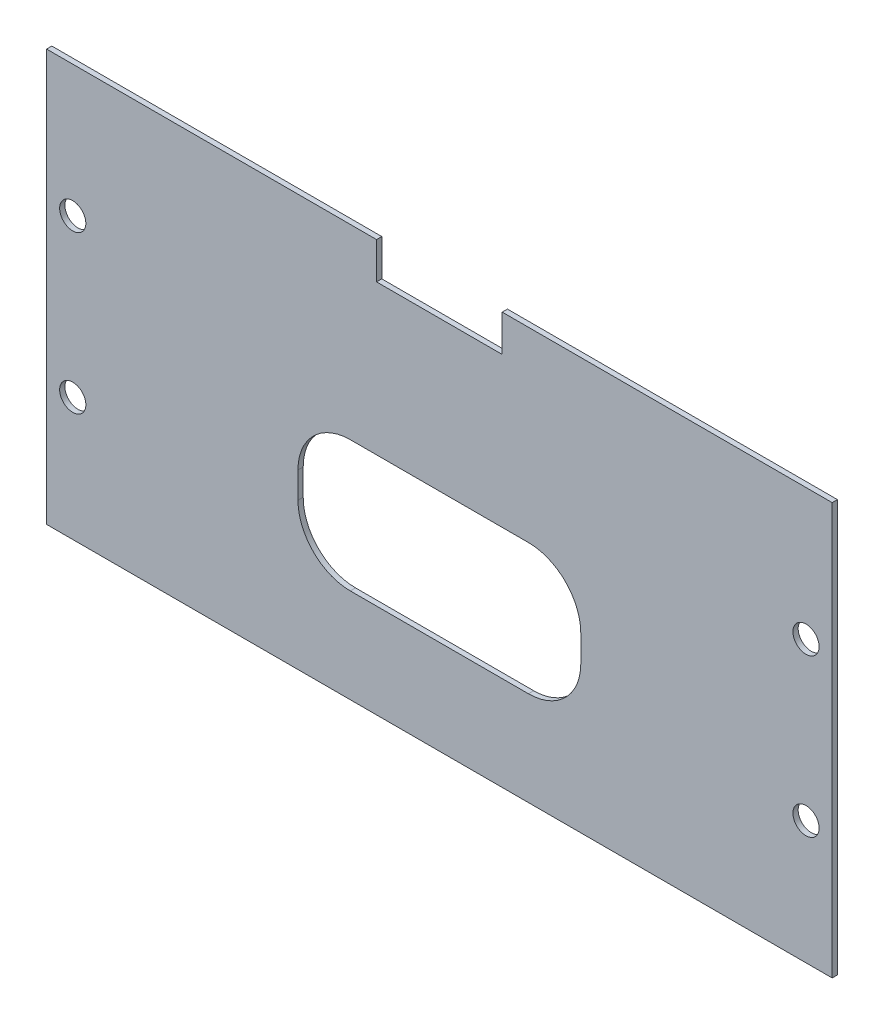
ISO-10303-21;
HEADER;
FILE_DESCRIPTION(('STEP AP214'),'2;1');
FILE_NAME('part.step','',(''),(''),'','','');
FILE_SCHEMA(('AUTOMOTIVE_DESIGN { 1 0 10303 214 1 1 1 1 }'));
ENDSEC;
DATA;
#1=APPLICATION_CONTEXT('core data for automotive mechanical design processes');
#2=APPLICATION_PROTOCOL_DEFINITION('international standard','automotive_design',2000,#1);
#3=PRODUCT_CONTEXT('',#1,'mechanical');
#4=PRODUCT('Part','Part','',(#3));
#5=PRODUCT_RELATED_PRODUCT_CATEGORY('part','',(#4));
#6=PRODUCT_DEFINITION_FORMATION('','',#4);
#7=PRODUCT_DEFINITION_CONTEXT('part definition',#1,'design');
#8=PRODUCT_DEFINITION('design','',#6,#7);
#9=PRODUCT_DEFINITION_SHAPE('','',#8);
#10=(LENGTH_UNIT() NAMED_UNIT(*) SI_UNIT(.MILLI.,.METRE.));
#11=(NAMED_UNIT(*) PLANE_ANGLE_UNIT() SI_UNIT($,.RADIAN.));
#12=(NAMED_UNIT(*) SI_UNIT($,.STERADIAN.) SOLID_ANGLE_UNIT());
#13=UNCERTAINTY_MEASURE_WITH_UNIT(LENGTH_MEASURE(1.E-05),#10,'distance_accuracy_value','');
#14=(GEOMETRIC_REPRESENTATION_CONTEXT(3) GLOBAL_UNCERTAINTY_ASSIGNED_CONTEXT((#13)) GLOBAL_UNIT_ASSIGNED_CONTEXT((#10,
#11,#12)) REPRESENTATION_CONTEXT('',''));
#15=CARTESIAN_POINT('',(0.,0.,0.));
#16=DIRECTION('',(0.,0.,1.));
#17=DIRECTION('',(1.,0.,0.));
#18=AXIS2_PLACEMENT_3D('',#15,#16,#17);
#19=CARTESIAN_POINT('',(-75.,41.8,1.));
#20=DIRECTION('',(0.,-1.,0.));
#21=DIRECTION('',(0.,0.,-1.));
#22=AXIS2_PLACEMENT_3D('',#19,#20,#21);
#23=PLANE('',#22);
#24=DIRECTION('',(-1.,0.,0.));
#25=VECTOR('',#24,1.);
#26=CARTESIAN_POINT('',(-75.,41.8,1.));
#27=LINE('',#26,#25);
#28=CARTESIAN_POINT('',(-12.,41.8,1.));
#29=VERTEX_POINT('',#28);
#30=CARTESIAN_POINT('',(-75.,41.8,1.));
#31=VERTEX_POINT('',#30);
#32=EDGE_CURVE('E172',#29,#31,#27,.T.);
#33=ORIENTED_EDGE('',*,*,#32,.F.);
#34=DIRECTION('',(0.,0.,-1.));
#35=VECTOR('',#34,1.);
#36=CARTESIAN_POINT('',(-12.,41.8,1.));
#37=LINE('',#36,#35);
#38=CARTESIAN_POINT('',(-12.,41.8,0.));
#39=VERTEX_POINT('',#38);
#40=EDGE_CURVE('E212',#29,#39,#37,.T.);
#41=ORIENTED_EDGE('',*,*,#40,.T.);
#42=DIRECTION('',(-1.,0.,0.));
#43=VECTOR('',#42,1.);
#44=CARTESIAN_POINT('',(-75.,41.8,0.));
#45=LINE('',#44,#43);
#46=CARTESIAN_POINT('',(-75.,41.8,0.));
#47=VERTEX_POINT('',#46);
#48=EDGE_CURVE('E188',#39,#47,#45,.T.);
#49=ORIENTED_EDGE('',*,*,#48,.T.);
#50=DIRECTION('',(0.,0.,-1.));
#51=VECTOR('',#50,1.);
#52=CARTESIAN_POINT('',(-75.,41.8,1.));
#53=LINE('',#52,#51);
#54=EDGE_CURVE('E185',#31,#47,#53,.T.);
#55=ORIENTED_EDGE('',*,*,#54,.F.);
#56=EDGE_LOOP('',(#33,#41,#49,#55));
#57=FACE_BOUND('',#56,.T.);
#58=ADVANCED_FACE('F37',(#57),#23,.F.);
#59=CARTESIAN_POINT('',(0.,0.,1.));
#60=DIRECTION('',(0.,0.,-1.));
#61=DIRECTION('',(-1.,0.,0.));
#62=AXIS2_PLACEMENT_3D('',#59,#60,#61);
#63=PLANE('',#62);
#64=CARTESIAN_POINT('',(-70.,-13.28,1.));
#65=DIRECTION('',(0.,0.,1.));
#66=DIRECTION('',(1.,0.,0.));
#67=AXIS2_PLACEMENT_3D('',#64,#65,#66);
#68=CIRCLE('',#67,2.50000000000001);
#69=CARTESIAN_POINT('',(-67.5,-13.28,1.));
#70=VERTEX_POINT('',#69);
#71=EDGE_CURVE('E354',#70,#70,#68,.T.);
#72=ORIENTED_EDGE('',*,*,#71,.F.);
#73=EDGE_LOOP('',(#72));
#74=FACE_BOUND('',#73,.T.);
#75=CARTESIAN_POINT('',(-70.,16.72,1.));
#76=DIRECTION('',(0.,0.,1.));
#77=DIRECTION('',(1.,0.,0.));
#78=AXIS2_PLACEMENT_3D('',#75,#76,#77);
#79=CIRCLE('',#78,2.5);
#80=CARTESIAN_POINT('',(-67.5,16.72,1.));
#81=VERTEX_POINT('',#80);
#82=EDGE_CURVE('E200',#81,#81,#79,.T.);
#83=ORIENTED_EDGE('',*,*,#82,.F.);
#84=EDGE_LOOP('',(#83));
#85=FACE_BOUND('',#84,.T.);
#86=DIRECTION('',(1.,0.,0.));
#87=VECTOR('',#86,1.);
#88=CARTESIAN_POINT('',(-27.,6.20000000000002,1.));
#89=LINE('',#88,#87);
#90=CARTESIAN_POINT('',(-17.,6.20000000000002,1.));
#91=VERTEX_POINT('',#90);
#92=CARTESIAN_POINT('',(17.,6.20000000000001,1.));
#93=VERTEX_POINT('',#92);
#94=EDGE_CURVE('E257',#91,#93,#89,.T.);
#95=ORIENTED_EDGE('',*,*,#94,.T.);
#96=CARTESIAN_POINT('',(17.,-3.79999999999999,1.));
#97=DIRECTION('',(0.,0.,-1.));
#98=DIRECTION('',(-1.,0.,0.));
#99=AXIS2_PLACEMENT_3D('',#96,#97,#98);
#100=CIRCLE('',#99,10.);
#101=CARTESIAN_POINT('',(27.,-3.79999999999998,1.));
#102=VERTEX_POINT('',#101);
#103=EDGE_CURVE('E240',#93,#102,#100,.T.);
#104=ORIENTED_EDGE('',*,*,#103,.T.);
#105=DIRECTION('',(0.,-1.,0.));
#106=VECTOR('',#105,1.);
#107=CARTESIAN_POINT('',(27.,6.20000000000001,1.));
#108=LINE('',#107,#106);
#109=CARTESIAN_POINT('',(27.,-8.79999999999999,1.));
#110=VERTEX_POINT('',#109);
#111=EDGE_CURVE('E280',#102,#110,#108,.T.);
#112=ORIENTED_EDGE('',*,*,#111,.T.);
#113=CARTESIAN_POINT('',(17.,-8.79999999999999,1.));
#114=DIRECTION('',(0.,0.,-1.));
#115=DIRECTION('',(-1.,0.,0.));
#116=AXIS2_PLACEMENT_3D('',#113,#114,#115);
#117=CIRCLE('',#116,10.);
#118=CARTESIAN_POINT('',(17.,-18.8,1.));
#119=VERTEX_POINT('',#118);
#120=EDGE_CURVE('E236',#110,#119,#117,.T.);
#121=ORIENTED_EDGE('',*,*,#120,.T.);
#122=DIRECTION('',(1.,0.,0.));
#123=VECTOR('',#122,1.);
#124=CARTESIAN_POINT('',(-27.,-18.8,1.));
#125=LINE('',#124,#123);
#126=CARTESIAN_POINT('',(-17.,-18.8,1.));
#127=VERTEX_POINT('',#126);
#128=EDGE_CURVE('E209',#127,#119,#125,.T.);
#129=ORIENTED_EDGE('',*,*,#128,.F.);
#130=CARTESIAN_POINT('',(-17.,-8.8,1.));
#131=DIRECTION('',(0.,0.,-1.));
#132=DIRECTION('',(-1.,0.,0.));
#133=AXIS2_PLACEMENT_3D('',#130,#131,#132);
#134=CIRCLE('',#133,10.);
#135=CARTESIAN_POINT('',(-27.,-8.79999999999998,1.));
#136=VERTEX_POINT('',#135);
#137=EDGE_CURVE('E45',#127,#136,#134,.T.);
#138=ORIENTED_EDGE('',*,*,#137,.T.);
#139=DIRECTION('',(0.,-1.,0.));
#140=VECTOR('',#139,1.);
#141=CARTESIAN_POINT('',(-27.,6.20000000000002,1.));
#142=LINE('',#141,#140);
#143=CARTESIAN_POINT('',(-27.,-3.79999999999997,1.));
#144=VERTEX_POINT('',#143);
#145=EDGE_CURVE('E181',#144,#136,#142,.T.);
#146=ORIENTED_EDGE('',*,*,#145,.F.);
#147=CARTESIAN_POINT('',(-17.,-3.79999999999998,1.));
#148=DIRECTION('',(0.,0.,-1.));
#149=DIRECTION('',(-1.,0.,0.));
#150=AXIS2_PLACEMENT_3D('',#147,#148,#149);
#151=CIRCLE('',#150,10.);
#152=EDGE_CURVE('E244',#144,#91,#151,.T.);
#153=ORIENTED_EDGE('',*,*,#152,.T.);
#154=EDGE_LOOP('',(#95,#104,#112,#121,#129,#138,#146,#153));
#155=FACE_BOUND('',#154,.T.);
#156=DIRECTION('',(0.,-1.,0.));
#157=VECTOR('',#156,1.);
#158=CARTESIAN_POINT('',(-75.,-41.8,1.));
#159=LINE('',#158,#157);
#160=CARTESIAN_POINT('',(-75.,-36.8,1.));
#161=VERTEX_POINT('',#160);
#162=EDGE_CURVE('E166',#31,#161,#159,.T.);
#163=ORIENTED_EDGE('',*,*,#162,.T.);
#164=DIRECTION('',(-1.,0.,0.));
#165=VECTOR('',#164,1.);
#166=CARTESIAN_POINT('',(-75.,-36.8,1.));
#167=LINE('',#166,#165);
#168=CARTESIAN_POINT('',(75.,-36.8,1.));
#169=VERTEX_POINT('',#168);
#170=EDGE_CURVE('E52',#169,#161,#167,.T.);
#171=ORIENTED_EDGE('',*,*,#170,.F.);
#172=DIRECTION('',(0.,1.,0.));
#173=VECTOR('',#172,1.);
#174=CARTESIAN_POINT('',(75.,-41.8,1.));
#175=LINE('',#174,#173);
#176=CARTESIAN_POINT('',(75.,41.8,1.));
#177=VERTEX_POINT('',#176);
#178=EDGE_CURVE('E163',#169,#177,#175,.T.);
#179=ORIENTED_EDGE('',*,*,#178,.T.);
#180=CARTESIAN_POINT('',(12.,41.8,1.));
#181=VERTEX_POINT('',#180);
#182=EDGE_CURVE('E175',#177,#181,#27,.T.);
#183=ORIENTED_EDGE('',*,*,#182,.T.);
#184=DIRECTION('',(0.,1.,0.));
#185=VECTOR('',#184,1.);
#186=CARTESIAN_POINT('',(12.,34.8,1.));
#187=LINE('',#186,#185);
#188=CARTESIAN_POINT('',(12.,34.8,1.));
#189=VERTEX_POINT('',#188);
#190=EDGE_CURVE('E532',#189,#181,#187,.T.);
#191=ORIENTED_EDGE('',*,*,#190,.F.);
#192=DIRECTION('',(1.,0.,0.));
#193=VECTOR('',#192,1.);
#194=CARTESIAN_POINT('',(0.,34.8,1.));
#195=LINE('',#194,#193);
#196=CARTESIAN_POINT('',(-12.,34.8,1.));
#197=VERTEX_POINT('',#196);
#198=EDGE_CURVE('E527',#197,#189,#195,.T.);
#199=ORIENTED_EDGE('',*,*,#198,.F.);
#200=DIRECTION('',(0.,-1.,0.));
#201=VECTOR('',#200,1.);
#202=CARTESIAN_POINT('',(-12.,41.8,1.));
#203=LINE('',#202,#201);
#204=EDGE_CURVE('E534',#29,#197,#203,.T.);
#205=ORIENTED_EDGE('',*,*,#204,.F.);
#206=ORIENTED_EDGE('',*,*,#32,.T.);
#207=EDGE_LOOP('',(#163,#171,#179,#183,#191,#199,#205,#206));
#208=FACE_BOUND('',#207,.T.);
#209=CARTESIAN_POINT('',(70.,-13.2800000000001,1.));
#210=DIRECTION('',(0.,0.,1.));
#211=DIRECTION('',(1.,0.,0.));
#212=AXIS2_PLACEMENT_3D('',#209,#210,#211);
#213=CIRCLE('',#212,2.50000000000001);
#214=CARTESIAN_POINT('',(72.5,-13.2800000000001,1.));
#215=VERTEX_POINT('',#214);
#216=EDGE_CURVE('E345',#215,#215,#213,.F.);
#217=ORIENTED_EDGE('',*,*,#216,.T.);
#218=EDGE_LOOP('',(#217));
#219=FACE_BOUND('',#218,.T.);
#220=CARTESIAN_POINT('',(70.0000000000001,16.7199999999999,1.));
#221=DIRECTION('',(0.,0.,1.));
#222=DIRECTION('',(1.,0.,0.));
#223=AXIS2_PLACEMENT_3D('',#220,#221,#222);
#224=CIRCLE('',#223,2.5);
#225=CARTESIAN_POINT('',(72.5000000000001,16.7199999999999,1.));
#226=VERTEX_POINT('',#225);
#227=EDGE_CURVE('E353',#226,#226,#224,.F.);
#228=ORIENTED_EDGE('',*,*,#227,.T.);
#229=EDGE_LOOP('',(#228));
#230=FACE_BOUND('',#229,.T.);
#231=ADVANCED_FACE('F160',(#74,#85,#155,#208,#219,#230),#63,.F.);
#232=CARTESIAN_POINT('',(0.,0.,0.));
#233=DIRECTION('',(0.,0.,-1.));
#234=DIRECTION('',(-1.,0.,0.));
#235=AXIS2_PLACEMENT_3D('',#232,#233,#234);
#236=PLANE('',#235);
#237=DIRECTION('',(1.,0.,0.));
#238=VECTOR('',#237,1.);
#239=CARTESIAN_POINT('',(0.,-36.8,0.));
#240=LINE('',#239,#238);
#241=CARTESIAN_POINT('',(-75.,-36.8,0.));
#242=VERTEX_POINT('',#241);
#243=CARTESIAN_POINT('',(75.,-36.8,0.));
#244=VERTEX_POINT('',#243);
#245=EDGE_CURVE('E152',#242,#244,#240,.T.);
#246=ORIENTED_EDGE('',*,*,#245,.F.);
#247=DIRECTION('',(0.,-1.,0.));
#248=VECTOR('',#247,1.);
#249=CARTESIAN_POINT('',(-75.,-41.8,0.));
#250=LINE('',#249,#248);
#251=EDGE_CURVE('E173',#47,#242,#250,.T.);
#252=ORIENTED_EDGE('',*,*,#251,.F.);
#253=ORIENTED_EDGE('',*,*,#48,.F.);
#254=DIRECTION('',(0.,1.,0.));
#255=VECTOR('',#254,1.);
#256=CARTESIAN_POINT('',(-12.,0.,0.));
#257=LINE('',#256,#255);
#258=CARTESIAN_POINT('',(-12.,34.8,0.));
#259=VERTEX_POINT('',#258);
#260=EDGE_CURVE('E342',#259,#39,#257,.T.);
#261=ORIENTED_EDGE('',*,*,#260,.F.);
#262=DIRECTION('',(-1.,0.,0.));
#263=VECTOR('',#262,1.);
#264=CARTESIAN_POINT('',(0.,34.8,0.));
#265=LINE('',#264,#263);
#266=CARTESIAN_POINT('',(12.,34.8,0.));
#267=VERTEX_POINT('',#266);
#268=EDGE_CURVE('E215',#267,#259,#265,.T.);
#269=ORIENTED_EDGE('',*,*,#268,.F.);
#270=DIRECTION('',(0.,-1.,0.));
#271=VECTOR('',#270,1.);
#272=CARTESIAN_POINT('',(12.,0.,0.));
#273=LINE('',#272,#271);
#274=CARTESIAN_POINT('',(12.,41.8,0.));
#275=VERTEX_POINT('',#274);
#276=EDGE_CURVE('E338',#275,#267,#273,.T.);
#277=ORIENTED_EDGE('',*,*,#276,.F.);
#278=CARTESIAN_POINT('',(75.,41.8,0.));
#279=VERTEX_POINT('',#278);
#280=EDGE_CURVE('E178',#279,#275,#45,.T.);
#281=ORIENTED_EDGE('',*,*,#280,.F.);
#282=DIRECTION('',(0.,1.,0.));
#283=VECTOR('',#282,1.);
#284=CARTESIAN_POINT('',(75.,-41.8,0.));
#285=LINE('',#284,#283);
#286=EDGE_CURVE('E186',#244,#279,#285,.T.);
#287=ORIENTED_EDGE('',*,*,#286,.F.);
#288=EDGE_LOOP('',(#246,#252,#253,#261,#269,#277,#281,#287));
#289=FACE_BOUND('',#288,.T.);
#290=CARTESIAN_POINT('',(-70.,-13.28,0.));
#291=DIRECTION('',(0.,0.,-1.));
#292=DIRECTION('',(-1.,0.,0.));
#293=AXIS2_PLACEMENT_3D('',#290,#291,#292);
#294=CIRCLE('',#293,2.50000000000001);
#295=CARTESIAN_POINT('',(-67.5,-13.28,0.));
#296=VERTEX_POINT('',#295);
#297=EDGE_CURVE('E206',#296,#296,#294,.T.);
#298=ORIENTED_EDGE('',*,*,#297,.F.);
#299=EDGE_LOOP('',(#298));
#300=FACE_BOUND('',#299,.T.);
#301=CARTESIAN_POINT('',(70.,-13.2800000000001,0.));
#302=DIRECTION('',(0.,0.,-1.));
#303=DIRECTION('',(-1.,0.,0.));
#304=AXIS2_PLACEMENT_3D('',#301,#302,#303);
#305=CIRCLE('',#304,2.50000000000001);
#306=CARTESIAN_POINT('',(72.5,-13.2800000000001,0.));
#307=VERTEX_POINT('',#306);
#308=EDGE_CURVE('E199',#307,#307,#305,.F.);
#309=ORIENTED_EDGE('',*,*,#308,.T.);
#310=EDGE_LOOP('',(#309));
#311=FACE_BOUND('',#310,.T.);
#312=CARTESIAN_POINT('',(-70.,16.72,0.));
#313=DIRECTION('',(0.,0.,-1.));
#314=DIRECTION('',(-1.,0.,0.));
#315=AXIS2_PLACEMENT_3D('',#312,#313,#314);
#316=CIRCLE('',#315,2.5);
#317=CARTESIAN_POINT('',(-67.5,16.72,0.));
#318=VERTEX_POINT('',#317);
#319=EDGE_CURVE('E196',#318,#318,#316,.T.);
#320=ORIENTED_EDGE('',*,*,#319,.F.);
#321=EDGE_LOOP('',(#320));
#322=FACE_BOUND('',#321,.T.);
#323=DIRECTION('',(0.,-1.,0.));
#324=VECTOR('',#323,1.);
#325=CARTESIAN_POINT('',(-27.,6.20000000000002,0.));
#326=LINE('',#325,#324);
#327=CARTESIAN_POINT('',(-27.,-3.79999999999997,0.));
#328=VERTEX_POINT('',#327);
#329=CARTESIAN_POINT('',(-27.,-8.79999999999998,0.));
#330=VERTEX_POINT('',#329);
#331=EDGE_CURVE('E189',#328,#330,#326,.T.);
#332=ORIENTED_EDGE('',*,*,#331,.T.);
#333=CARTESIAN_POINT('',(-17.,-8.8,0.));
#334=DIRECTION('',(0.,0.,-1.));
#335=DIRECTION('',(-1.,0.,0.));
#336=AXIS2_PLACEMENT_3D('',#333,#334,#335);
#337=CIRCLE('',#336,10.);
#338=CARTESIAN_POINT('',(-17.,-18.8,0.));
#339=VERTEX_POINT('',#338);
#340=EDGE_CURVE('E11',#330,#339,#337,.F.);
#341=ORIENTED_EDGE('',*,*,#340,.T.);
#342=DIRECTION('',(1.,0.,0.));
#343=VECTOR('',#342,1.);
#344=CARTESIAN_POINT('',(-27.,-18.8,0.));
#345=LINE('',#344,#343);
#346=CARTESIAN_POINT('',(17.,-18.8,0.));
#347=VERTEX_POINT('',#346);
#348=EDGE_CURVE('E256',#339,#347,#345,.T.);
#349=ORIENTED_EDGE('',*,*,#348,.T.);
#350=CARTESIAN_POINT('',(17.,-8.79999999999999,0.));
#351=DIRECTION('',(0.,0.,-1.));
#352=DIRECTION('',(-1.,0.,0.));
#353=AXIS2_PLACEMENT_3D('',#350,#351,#352);
#354=CIRCLE('',#353,10.);
#355=CARTESIAN_POINT('',(27.,-8.79999999999999,0.));
#356=VERTEX_POINT('',#355);
#357=EDGE_CURVE('E238',#347,#356,#354,.F.);
#358=ORIENTED_EDGE('',*,*,#357,.T.);
#359=DIRECTION('',(0.,-1.,0.));
#360=VECTOR('',#359,1.);
#361=CARTESIAN_POINT('',(27.,6.20000000000001,0.));
#362=LINE('',#361,#360);
#363=CARTESIAN_POINT('',(27.,-3.79999999999998,0.));
#364=VERTEX_POINT('',#363);
#365=EDGE_CURVE('E268',#364,#356,#362,.T.);
#366=ORIENTED_EDGE('',*,*,#365,.F.);
#367=CARTESIAN_POINT('',(17.,-3.79999999999999,0.));
#368=DIRECTION('',(0.,0.,-1.));
#369=DIRECTION('',(-1.,0.,0.));
#370=AXIS2_PLACEMENT_3D('',#367,#368,#369);
#371=CIRCLE('',#370,10.);
#372=CARTESIAN_POINT('',(17.,6.20000000000001,0.));
#373=VERTEX_POINT('',#372);
#374=EDGE_CURVE('E242',#364,#373,#371,.F.);
#375=ORIENTED_EDGE('',*,*,#374,.T.);
#376=DIRECTION('',(1.,0.,0.));
#377=VECTOR('',#376,1.);
#378=CARTESIAN_POINT('',(-27.,6.20000000000002,0.));
#379=LINE('',#378,#377);
#380=CARTESIAN_POINT('',(-17.,6.20000000000002,0.));
#381=VERTEX_POINT('',#380);
#382=EDGE_CURVE('E271',#381,#373,#379,.T.);
#383=ORIENTED_EDGE('',*,*,#382,.F.);
#384=CARTESIAN_POINT('',(-17.,-3.79999999999998,0.));
#385=DIRECTION('',(0.,0.,-1.));
#386=DIRECTION('',(-1.,0.,0.));
#387=AXIS2_PLACEMENT_3D('',#384,#385,#386);
#388=CIRCLE('',#387,10.);
#389=EDGE_CURVE('E246',#381,#328,#388,.F.);
#390=ORIENTED_EDGE('',*,*,#389,.T.);
#391=EDGE_LOOP('',(#332,#341,#349,#358,#366,#375,#383,#390));
#392=FACE_BOUND('',#391,.T.);
#393=CARTESIAN_POINT('',(70.0000000000001,16.7199999999999,0.));
#394=DIRECTION('',(0.,0.,-1.));
#395=DIRECTION('',(-1.,0.,0.));
#396=AXIS2_PLACEMENT_3D('',#393,#394,#395);
#397=CIRCLE('',#396,2.5);
#398=CARTESIAN_POINT('',(72.5000000000001,16.7199999999999,0.));
#399=VERTEX_POINT('',#398);
#400=EDGE_CURVE('E203',#399,#399,#397,.F.);
#401=ORIENTED_EDGE('',*,*,#400,.T.);
#402=EDGE_LOOP('',(#401));
#403=FACE_BOUND('',#402,.T.);
#404=ADVANCED_FACE('F262',(#289,#300,#311,#322,#392,#403),#236,.T.);
#405=CARTESIAN_POINT('',(75.,-41.8,1.));
#406=DIRECTION('',(-1.,0.,0.));
#407=DIRECTION('',(0.,0.,1.));
#408=AXIS2_PLACEMENT_3D('',#405,#406,#407);
#409=PLANE('',#408);
#410=ORIENTED_EDGE('',*,*,#178,.F.);
#411=DIRECTION('',(0.,0.,1.));
#412=VECTOR('',#411,1.);
#413=CARTESIAN_POINT('',(75.,-36.8,-9.));
#414=LINE('',#413,#412);
#415=EDGE_CURVE('E149',#244,#169,#414,.T.);
#416=ORIENTED_EDGE('',*,*,#415,.F.);
#417=ORIENTED_EDGE('',*,*,#286,.T.);
#418=DIRECTION('',(0.,0.,-1.));
#419=VECTOR('',#418,1.);
#420=CARTESIAN_POINT('',(75.,41.8,1.));
#421=LINE('',#420,#419);
#422=EDGE_CURVE('E171',#177,#279,#421,.T.);
#423=ORIENTED_EDGE('',*,*,#422,.F.);
#424=EDGE_LOOP('',(#410,#416,#417,#423));
#425=FACE_BOUND('',#424,.T.);
#426=ADVANCED_FACE('F169',(#425),#409,.F.);
#427=ORIENTED_EDGE('',*,*,#280,.T.);
#428=DIRECTION('',(0.,0.,1.));
#429=VECTOR('',#428,1.);
#430=CARTESIAN_POINT('',(12.,41.8,1.));
#431=LINE('',#430,#429);
#432=EDGE_CURVE('E195',#275,#181,#431,.T.);
#433=ORIENTED_EDGE('',*,*,#432,.T.);
#434=ORIENTED_EDGE('',*,*,#182,.F.);
#435=ORIENTED_EDGE('',*,*,#422,.T.);
#436=EDGE_LOOP('',(#427,#433,#434,#435));
#437=FACE_BOUND('',#436,.T.);
#438=ADVANCED_FACE('F317',(#437),#23,.F.);
#439=CARTESIAN_POINT('',(-75.,-41.8,1.));
#440=DIRECTION('',(1.,0.,0.));
#441=DIRECTION('',(0.,0.,-1.));
#442=AXIS2_PLACEMENT_3D('',#439,#440,#441);
#443=PLANE('',#442);
#444=ORIENTED_EDGE('',*,*,#251,.T.);
#445=DIRECTION('',(0.,0.,1.));
#446=VECTOR('',#445,1.);
#447=CARTESIAN_POINT('',(-75.,-36.8,-9.));
#448=LINE('',#447,#446);
#449=EDGE_CURVE('E156',#242,#161,#448,.T.);
#450=ORIENTED_EDGE('',*,*,#449,.T.);
#451=ORIENTED_EDGE('',*,*,#162,.F.);
#452=ORIENTED_EDGE('',*,*,#54,.T.);
#453=EDGE_LOOP('',(#444,#450,#451,#452));
#454=FACE_BOUND('',#453,.T.);
#455=ADVANCED_FACE('F326',(#454),#443,.F.);
#456=CARTESIAN_POINT('',(-27.,-18.8,0.));
#457=DIRECTION('',(0.,-1.,0.));
#458=DIRECTION('',(1.,0.,0.));
#459=AXIS2_PLACEMENT_3D('',#456,#457,#458);
#460=PLANE('',#459);
#461=ORIENTED_EDGE('',*,*,#128,.T.);
#462=DIRECTION('',(0.,0.,1.));
#463=VECTOR('',#462,1.);
#464=CARTESIAN_POINT('',(17.,-18.8,0.));
#465=LINE('',#464,#463);
#466=EDGE_CURVE('E225',#119,#347,#465,.F.);
#467=ORIENTED_EDGE('',*,*,#466,.T.);
#468=ORIENTED_EDGE('',*,*,#348,.F.);
#469=DIRECTION('',(0.,0.,1.));
#470=VECTOR('',#469,1.);
#471=CARTESIAN_POINT('',(-17.,-18.8,1.));
#472=LINE('',#471,#470);
#473=EDGE_CURVE('E222',#339,#127,#472,.T.);
#474=ORIENTED_EDGE('',*,*,#473,.T.);
#475=EDGE_LOOP('',(#461,#467,#468,#474));
#476=FACE_BOUND('',#475,.T.);
#477=ADVANCED_FACE('F266',(#476),#460,.F.);
#478=CARTESIAN_POINT('',(-27.,6.20000000000002,0.));
#479=DIRECTION('',(-1.,0.,0.));
#480=DIRECTION('',(0.,-1.,0.));
#481=AXIS2_PLACEMENT_3D('',#478,#479,#480);
#482=PLANE('',#481);
#483=ORIENTED_EDGE('',*,*,#331,.F.);
#484=DIRECTION('',(0.,0.,1.));
#485=VECTOR('',#484,1.);
#486=CARTESIAN_POINT('',(-27.,-3.79999999999997,0.));
#487=LINE('',#486,#485);
#488=EDGE_CURVE('E233',#328,#144,#487,.T.);
#489=ORIENTED_EDGE('',*,*,#488,.T.);
#490=ORIENTED_EDGE('',*,*,#145,.T.);
#491=DIRECTION('',(0.,0.,1.));
#492=VECTOR('',#491,1.);
#493=CARTESIAN_POINT('',(-27.,-8.79999999999998,0.));
#494=LINE('',#493,#492);
#495=EDGE_CURVE('E60',#136,#330,#494,.F.);
#496=ORIENTED_EDGE('',*,*,#495,.T.);
#497=EDGE_LOOP('',(#483,#489,#490,#496));
#498=FACE_BOUND('',#497,.T.);
#499=ADVANCED_FACE('F254',(#498),#482,.F.);
#500=CARTESIAN_POINT('',(-27.,6.20000000000002,0.));
#501=DIRECTION('',(0.,-1.,0.));
#502=DIRECTION('',(1.,0.,0.));
#503=AXIS2_PLACEMENT_3D('',#500,#501,#502);
#504=PLANE('',#503);
#505=ORIENTED_EDGE('',*,*,#382,.T.);
#506=DIRECTION('',(0.,0.,1.));
#507=VECTOR('',#506,1.);
#508=CARTESIAN_POINT('',(17.,6.20000000000002,1.));
#509=LINE('',#508,#507);
#510=EDGE_CURVE('E229',#373,#93,#509,.T.);
#511=ORIENTED_EDGE('',*,*,#510,.T.);
#512=ORIENTED_EDGE('',*,*,#94,.F.);
#513=DIRECTION('',(0.,0.,1.));
#514=VECTOR('',#513,1.);
#515=CARTESIAN_POINT('',(-17.,6.20000000000002,0.));
#516=LINE('',#515,#514);
#517=EDGE_CURVE('E227',#91,#381,#516,.F.);
#518=ORIENTED_EDGE('',*,*,#517,.T.);
#519=EDGE_LOOP('',(#505,#511,#512,#518));
#520=FACE_BOUND('',#519,.T.);
#521=ADVANCED_FACE('F286',(#520),#504,.T.);
#522=CARTESIAN_POINT('',(27.,6.20000000000001,0.));
#523=DIRECTION('',(-1.,0.,0.));
#524=DIRECTION('',(0.,-1.,0.));
#525=AXIS2_PLACEMENT_3D('',#522,#523,#524);
#526=PLANE('',#525);
#527=ORIENTED_EDGE('',*,*,#365,.T.);
#528=DIRECTION('',(0.,0.,1.));
#529=VECTOR('',#528,1.);
#530=CARTESIAN_POINT('',(27.,-8.79999999999999,0.));
#531=LINE('',#530,#529);
#532=EDGE_CURVE('E219',#356,#110,#531,.T.);
#533=ORIENTED_EDGE('',*,*,#532,.T.);
#534=ORIENTED_EDGE('',*,*,#111,.F.);
#535=DIRECTION('',(0.,0.,1.));
#536=VECTOR('',#535,1.);
#537=CARTESIAN_POINT('',(27.,-3.79999999999998,0.));
#538=LINE('',#537,#536);
#539=EDGE_CURVE('E217',#102,#364,#538,.F.);
#540=ORIENTED_EDGE('',*,*,#539,.T.);
#541=EDGE_LOOP('',(#527,#533,#534,#540));
#542=FACE_BOUND('',#541,.T.);
#543=ADVANCED_FACE('F298',(#542),#526,.T.);
#544=CARTESIAN_POINT('',(-70.,16.72,-5.5));
#545=DIRECTION('',(0.,0.,1.));
#546=DIRECTION('',(1.,0.,0.));
#547=AXIS2_PLACEMENT_3D('',#544,#545,#546);
#548=CYLINDRICAL_SURFACE('',#547,2.5);
#549=CARTESIAN_POINT('',(-67.5,16.72,0.));
#550=CARTESIAN_POINT('',(-67.5,16.72,0.0104166666666675));
#551=CARTESIAN_POINT('',(-67.5,16.72,0.0208333333333342));
#552=CARTESIAN_POINT('',(-67.5,16.72,0.0416666666666676));
#553=CARTESIAN_POINT('',(-67.5,16.72,0.0520833333333343));
#554=CARTESIAN_POINT('',(-67.5,16.72,0.0729166666666676));
#555=CARTESIAN_POINT('',(-67.5,16.72,0.0833333333333343));
#556=CARTESIAN_POINT('',(-67.5,16.72,0.104166666666668));
#557=CARTESIAN_POINT('',(-67.5,16.72,0.114583333333334));
#558=CARTESIAN_POINT('',(-67.5,16.72,0.135416666666668));
#559=CARTESIAN_POINT('',(-67.5,16.72,0.145833333333334));
#560=CARTESIAN_POINT('',(-67.5,16.72,0.166666666666668));
#561=CARTESIAN_POINT('',(-67.5,16.72,0.177083333333334));
#562=CARTESIAN_POINT('',(-67.5,16.72,0.197916666666668));
#563=CARTESIAN_POINT('',(-67.5,16.72,0.208333333333334));
#564=CARTESIAN_POINT('',(-67.5,16.72,0.229166666666668));
#565=CARTESIAN_POINT('',(-67.5,16.72,0.239583333333334));
#566=CARTESIAN_POINT('',(-67.5,16.72,0.260416666666667));
#567=CARTESIAN_POINT('',(-67.5,16.72,0.270833333333334));
#568=CARTESIAN_POINT('',(-67.5,16.72,0.291666666666667));
#569=CARTESIAN_POINT('',(-67.5,16.72,0.302083333333334));
#570=CARTESIAN_POINT('',(-67.5,16.72,0.322916666666667));
#571=CARTESIAN_POINT('',(-67.5,16.72,0.333333333333334));
#572=CARTESIAN_POINT('',(-67.5,16.72,0.354166666666667));
#573=CARTESIAN_POINT('',(-67.5,16.72,0.364583333333334));
#574=CARTESIAN_POINT('',(-67.5,16.72,0.385416666666667));
#575=CARTESIAN_POINT('',(-67.5,16.72,0.395833333333334));
#576=CARTESIAN_POINT('',(-67.5,16.72,0.416666666666667));
#577=CARTESIAN_POINT('',(-67.5,16.72,0.427083333333334));
#578=CARTESIAN_POINT('',(-67.5,16.72,0.447916666666667));
#579=CARTESIAN_POINT('',(-67.5,16.72,0.458333333333334));
#580=CARTESIAN_POINT('',(-67.5,16.72,0.479166666666667));
#581=CARTESIAN_POINT('',(-67.5,16.72,0.489583333333334));
#582=CARTESIAN_POINT('',(-67.5,16.72,0.510416666666667));
#583=CARTESIAN_POINT('',(-67.5,16.72,0.520833333333334));
#584=CARTESIAN_POINT('',(-67.5,16.72,0.541666666666667));
#585=CARTESIAN_POINT('',(-67.5,16.72,0.552083333333334));
#586=CARTESIAN_POINT('',(-67.5,16.72,0.572916666666667));
#587=CARTESIAN_POINT('',(-67.5,16.72,0.583333333333334));
#588=CARTESIAN_POINT('',(-67.5,16.72,0.604166666666667));
#589=CARTESIAN_POINT('',(-67.5,16.72,0.614583333333334));
#590=CARTESIAN_POINT('',(-67.5,16.72,0.635416666666667));
#591=CARTESIAN_POINT('',(-67.5,16.72,0.645833333333334));
#592=CARTESIAN_POINT('',(-67.5,16.72,0.666666666666667));
#593=CARTESIAN_POINT('',(-67.5,16.72,0.677083333333334));
#594=CARTESIAN_POINT('',(-67.5,16.72,0.697916666666667));
#595=CARTESIAN_POINT('',(-67.5,16.72,0.708333333333333));
#596=CARTESIAN_POINT('',(-67.5,16.72,0.729166666666667));
#597=CARTESIAN_POINT('',(-67.5,16.72,0.739583333333333));
#598=CARTESIAN_POINT('',(-67.5,16.72,0.760416666666667));
#599=CARTESIAN_POINT('',(-67.5,16.72,0.770833333333333));
#600=CARTESIAN_POINT('',(-67.5,16.72,0.791666666666667));
#601=CARTESIAN_POINT('',(-67.5,16.72,0.802083333333333));
#602=CARTESIAN_POINT('',(-67.5,16.72,0.822916666666667));
#603=CARTESIAN_POINT('',(-67.5,16.72,0.833333333333333));
#604=CARTESIAN_POINT('',(-67.5,16.72,0.854166666666667));
#605=CARTESIAN_POINT('',(-67.5,16.72,0.864583333333333));
#606=CARTESIAN_POINT('',(-67.5,16.72,0.885416666666667));
#607=CARTESIAN_POINT('',(-67.5,16.72,0.895833333333333));
#608=CARTESIAN_POINT('',(-67.5,16.72,0.916666666666667));
#609=CARTESIAN_POINT('',(-67.5,16.72,0.927083333333333));
#610=CARTESIAN_POINT('',(-67.5,16.72,0.947916666666667));
#611=CARTESIAN_POINT('',(-67.5,16.72,0.958333333333333));
#612=CARTESIAN_POINT('',(-67.5,16.72,0.979166666666667));
#613=CARTESIAN_POINT('',(-67.5,16.72,0.989583333333333));
#614=CARTESIAN_POINT('',(-67.5,16.72,1.));
#615=B_SPLINE_CURVE_WITH_KNOTS('',3,(#549,#550,#551,#552,#553,#554,#555,#556,#557,#558,#559,
#560,#561,#562,#563,#564,#565,#566,#567,#568,#569,#570,#571,#572,#573,#574,#575,#576,#577,#578,
#579,#580,#581,#582,#583,#584,#585,#586,#587,#588,#589,#590,#591,#592,#593,#594,#595,#596,#597,
#598,#599,#600,#601,#602,#603,#604,#605,#606,#607,#608,#609,#610,#611,#612,#613,#614),
.UNSPECIFIED.,.F.,.F.,(4,2,2,2,2,2,2,2,2,2,2,2,2,2,2,2,2,2,2,2,2,2,2,2,2,2,2,2,2,2,2,2,4),(0.,
0.03125,0.0625000000000001,0.0937500000000001,0.125,0.15625,0.1875,0.21875,0.25,
0.281249999999999,0.312499999999999,0.343749999999999,0.374999999999999,0.40625,0.4375,0.46875,
0.5,0.53125,0.5625,0.59375,0.625,0.65625,0.6875,0.718749999999999,0.749999999999999,
0.781249999999999,0.812499999999999,0.843749999999999,0.874999999999999,0.906249999999999,
0.937499999999999,0.968749999999999,0.999999999999999),.UNSPECIFIED.);
#616=EDGE_CURVE('BSEAM373',#318,#81,#615,.T.);
#617=ORIENTED_EDGE('',*,*,#319,.T.);
#618=ORIENTED_EDGE('',*,*,#82,.T.);
#619=ORIENTED_EDGE('',*,*,#616,.T.);
#620=ORIENTED_EDGE('',*,*,#616,.F.);
#621=EDGE_LOOP('',(#617,#619,#618,#620));
#622=FACE_BOUND('',#621,.T.);
#623=ADVANCED_FACE('F373',(#622),#548,.F.);
#624=CARTESIAN_POINT('',(70.,-13.2800000000001,-5.5));
#625=DIRECTION('',(0.,0.,1.));
#626=DIRECTION('',(1.,0.,0.));
#627=AXIS2_PLACEMENT_3D('',#624,#625,#626);
#628=CYLINDRICAL_SURFACE('',#627,2.50000000000001);
#629=CARTESIAN_POINT('',(72.5,-13.2800000000001,0.));
#630=CARTESIAN_POINT('',(72.5,-13.2800000000001,0.0104166666666675));
#631=CARTESIAN_POINT('',(72.5,-13.2800000000001,0.0208333333333342));
#632=CARTESIAN_POINT('',(72.5,-13.2800000000001,0.0416666666666676));
#633=CARTESIAN_POINT('',(72.5,-13.2800000000001,0.0520833333333343));
#634=CARTESIAN_POINT('',(72.5,-13.2800000000001,0.0729166666666676));
#635=CARTESIAN_POINT('',(72.5,-13.2800000000001,0.0833333333333343));
#636=CARTESIAN_POINT('',(72.5,-13.2800000000001,0.104166666666668));
#637=CARTESIAN_POINT('',(72.5,-13.2800000000001,0.114583333333334));
#638=CARTESIAN_POINT('',(72.5,-13.2800000000001,0.135416666666668));
#639=CARTESIAN_POINT('',(72.5,-13.2800000000001,0.145833333333334));
#640=CARTESIAN_POINT('',(72.5,-13.2800000000001,0.166666666666668));
#641=CARTESIAN_POINT('',(72.5,-13.2800000000001,0.177083333333334));
#642=CARTESIAN_POINT('',(72.5,-13.2800000000001,0.197916666666668));
#643=CARTESIAN_POINT('',(72.5,-13.2800000000001,0.208333333333334));
#644=CARTESIAN_POINT('',(72.5,-13.2800000000001,0.229166666666668));
#645=CARTESIAN_POINT('',(72.5,-13.2800000000001,0.239583333333334));
#646=CARTESIAN_POINT('',(72.5,-13.2800000000001,0.260416666666667));
#647=CARTESIAN_POINT('',(72.5,-13.2800000000001,0.270833333333334));
#648=CARTESIAN_POINT('',(72.5,-13.2800000000001,0.291666666666667));
#649=CARTESIAN_POINT('',(72.5,-13.2800000000001,0.302083333333334));
#650=CARTESIAN_POINT('',(72.5,-13.2800000000001,0.322916666666667));
#651=CARTESIAN_POINT('',(72.5,-13.2800000000001,0.333333333333334));
#652=CARTESIAN_POINT('',(72.5,-13.2800000000001,0.354166666666667));
#653=CARTESIAN_POINT('',(72.5,-13.2800000000001,0.364583333333334));
#654=CARTESIAN_POINT('',(72.5,-13.2800000000001,0.385416666666667));
#655=CARTESIAN_POINT('',(72.5,-13.2800000000001,0.395833333333334));
#656=CARTESIAN_POINT('',(72.5,-13.2800000000001,0.416666666666667));
#657=CARTESIAN_POINT('',(72.5,-13.2800000000001,0.427083333333334));
#658=CARTESIAN_POINT('',(72.5,-13.2800000000001,0.447916666666667));
#659=CARTESIAN_POINT('',(72.5,-13.2800000000001,0.458333333333334));
#660=CARTESIAN_POINT('',(72.5,-13.2800000000001,0.479166666666667));
#661=CARTESIAN_POINT('',(72.5,-13.2800000000001,0.489583333333334));
#662=CARTESIAN_POINT('',(72.5,-13.2800000000001,0.510416666666667));
#663=CARTESIAN_POINT('',(72.5,-13.2800000000001,0.520833333333334));
#664=CARTESIAN_POINT('',(72.5,-13.2800000000001,0.541666666666667));
#665=CARTESIAN_POINT('',(72.5,-13.2800000000001,0.552083333333334));
#666=CARTESIAN_POINT('',(72.5,-13.2800000000001,0.572916666666667));
#667=CARTESIAN_POINT('',(72.5,-13.2800000000001,0.583333333333334));
#668=CARTESIAN_POINT('',(72.5,-13.2800000000001,0.604166666666667));
#669=CARTESIAN_POINT('',(72.5,-13.2800000000001,0.614583333333334));
#670=CARTESIAN_POINT('',(72.5,-13.2800000000001,0.635416666666667));
#671=CARTESIAN_POINT('',(72.5,-13.2800000000001,0.645833333333334));
#672=CARTESIAN_POINT('',(72.5,-13.2800000000001,0.666666666666667));
#673=CARTESIAN_POINT('',(72.5,-13.2800000000001,0.677083333333334));
#674=CARTESIAN_POINT('',(72.5,-13.2800000000001,0.697916666666667));
#675=CARTESIAN_POINT('',(72.5,-13.2800000000001,0.708333333333333));
#676=CARTESIAN_POINT('',(72.5,-13.2800000000001,0.729166666666667));
#677=CARTESIAN_POINT('',(72.5,-13.2800000000001,0.739583333333333));
#678=CARTESIAN_POINT('',(72.5,-13.2800000000001,0.760416666666667));
#679=CARTESIAN_POINT('',(72.5,-13.2800000000001,0.770833333333333));
#680=CARTESIAN_POINT('',(72.5,-13.2800000000001,0.791666666666667));
#681=CARTESIAN_POINT('',(72.5,-13.2800000000001,0.802083333333333));
#682=CARTESIAN_POINT('',(72.5,-13.2800000000001,0.822916666666667));
#683=CARTESIAN_POINT('',(72.5,-13.2800000000001,0.833333333333333));
#684=CARTESIAN_POINT('',(72.5,-13.2800000000001,0.854166666666667));
#685=CARTESIAN_POINT('',(72.5,-13.2800000000001,0.864583333333333));
#686=CARTESIAN_POINT('',(72.5,-13.2800000000001,0.885416666666667));
#687=CARTESIAN_POINT('',(72.5,-13.2800000000001,0.895833333333333));
#688=CARTESIAN_POINT('',(72.5,-13.2800000000001,0.916666666666667));
#689=CARTESIAN_POINT('',(72.5,-13.2800000000001,0.927083333333333));
#690=CARTESIAN_POINT('',(72.5,-13.2800000000001,0.947916666666667));
#691=CARTESIAN_POINT('',(72.5,-13.2800000000001,0.958333333333333));
#692=CARTESIAN_POINT('',(72.5,-13.2800000000001,0.979166666666667));
#693=CARTESIAN_POINT('',(72.5,-13.2800000000001,0.989583333333333));
#694=CARTESIAN_POINT('',(72.5,-13.2800000000001,1.));
#695=B_SPLINE_CURVE_WITH_KNOTS('',3,(#629,#630,#631,#632,#633,#634,#635,#636,#637,#638,#639,
#640,#641,#642,#643,#644,#645,#646,#647,#648,#649,#650,#651,#652,#653,#654,#655,#656,#657,#658,
#659,#660,#661,#662,#663,#664,#665,#666,#667,#668,#669,#670,#671,#672,#673,#674,#675,#676,#677,
#678,#679,#680,#681,#682,#683,#684,#685,#686,#687,#688,#689,#690,#691,#692,#693,#694),
.UNSPECIFIED.,.F.,.F.,(4,2,2,2,2,2,2,2,2,2,2,2,2,2,2,2,2,2,2,2,2,2,2,2,2,2,2,2,2,2,2,2,4),(0.,
0.03125,0.0625000000000001,0.0937500000000001,0.125,0.15625,0.1875,0.21875,0.25,
0.281249999999999,0.312499999999999,0.343749999999999,0.374999999999999,0.40625,0.4375,0.46875,
0.5,0.53125,0.5625,0.59375,0.625,0.65625,0.6875,0.718749999999999,0.749999999999999,
0.781249999999999,0.812499999999999,0.843749999999999,0.874999999999999,0.906249999999999,
0.937499999999999,0.968749999999999,0.999999999999999),.UNSPECIFIED.);
#696=EDGE_CURVE('BSEAM363',#307,#215,#695,.T.);
#697=ORIENTED_EDGE('',*,*,#308,.F.);
#698=ORIENTED_EDGE('',*,*,#216,.F.);
#699=ORIENTED_EDGE('',*,*,#696,.T.);
#700=ORIENTED_EDGE('',*,*,#696,.F.);
#701=EDGE_LOOP('',(#697,#699,#698,#700));
#702=FACE_BOUND('',#701,.T.);
#703=ADVANCED_FACE('F363',(#702),#628,.F.);
#704=CARTESIAN_POINT('',(70.0000000000001,16.7199999999999,-5.5));
#705=DIRECTION('',(0.,0.,1.));
#706=DIRECTION('',(1.,0.,0.));
#707=AXIS2_PLACEMENT_3D('',#704,#705,#706);
#708=CYLINDRICAL_SURFACE('',#707,2.5);
#709=CARTESIAN_POINT('',(72.5000000000001,16.7199999999999,0.));
#710=CARTESIAN_POINT('',(72.5000000000001,16.7199999999999,0.0104166666666675));
#711=CARTESIAN_POINT('',(72.5000000000001,16.7199999999999,0.0208333333333342));
#712=CARTESIAN_POINT('',(72.5000000000001,16.7199999999999,0.0416666666666676));
#713=CARTESIAN_POINT('',(72.5000000000001,16.7199999999999,0.0520833333333343));
#714=CARTESIAN_POINT('',(72.5000000000001,16.7199999999999,0.0729166666666676));
#715=CARTESIAN_POINT('',(72.5000000000001,16.7199999999999,0.0833333333333343));
#716=CARTESIAN_POINT('',(72.5000000000001,16.7199999999999,0.104166666666668));
#717=CARTESIAN_POINT('',(72.5000000000001,16.7199999999999,0.114583333333334));
#718=CARTESIAN_POINT('',(72.5000000000001,16.7199999999999,0.135416666666668));
#719=CARTESIAN_POINT('',(72.5000000000001,16.7199999999999,0.145833333333334));
#720=CARTESIAN_POINT('',(72.5000000000001,16.7199999999999,0.166666666666668));
#721=CARTESIAN_POINT('',(72.5000000000001,16.7199999999999,0.177083333333334));
#722=CARTESIAN_POINT('',(72.5000000000001,16.7199999999999,0.197916666666668));
#723=CARTESIAN_POINT('',(72.5000000000001,16.7199999999999,0.208333333333334));
#724=CARTESIAN_POINT('',(72.5000000000001,16.7199999999999,0.229166666666668));
#725=CARTESIAN_POINT('',(72.5000000000001,16.7199999999999,0.239583333333334));
#726=CARTESIAN_POINT('',(72.5000000000001,16.7199999999999,0.260416666666667));
#727=CARTESIAN_POINT('',(72.5000000000001,16.7199999999999,0.270833333333334));
#728=CARTESIAN_POINT('',(72.5000000000001,16.7199999999999,0.291666666666667));
#729=CARTESIAN_POINT('',(72.5000000000001,16.7199999999999,0.302083333333334));
#730=CARTESIAN_POINT('',(72.5000000000001,16.7199999999999,0.322916666666667));
#731=CARTESIAN_POINT('',(72.5000000000001,16.7199999999999,0.333333333333334));
#732=CARTESIAN_POINT('',(72.5000000000001,16.7199999999999,0.354166666666667));
#733=CARTESIAN_POINT('',(72.5000000000001,16.7199999999999,0.364583333333334));
#734=CARTESIAN_POINT('',(72.5000000000001,16.7199999999999,0.385416666666667));
#735=CARTESIAN_POINT('',(72.5000000000001,16.7199999999999,0.395833333333334));
#736=CARTESIAN_POINT('',(72.5000000000001,16.7199999999999,0.416666666666667));
#737=CARTESIAN_POINT('',(72.5000000000001,16.7199999999999,0.427083333333334));
#738=CARTESIAN_POINT('',(72.5000000000001,16.7199999999999,0.447916666666667));
#739=CARTESIAN_POINT('',(72.5000000000001,16.7199999999999,0.458333333333334));
#740=CARTESIAN_POINT('',(72.5000000000001,16.7199999999999,0.479166666666667));
#741=CARTESIAN_POINT('',(72.5000000000001,16.7199999999999,0.489583333333334));
#742=CARTESIAN_POINT('',(72.5000000000001,16.7199999999999,0.510416666666667));
#743=CARTESIAN_POINT('',(72.5000000000001,16.7199999999999,0.520833333333334));
#744=CARTESIAN_POINT('',(72.5000000000001,16.7199999999999,0.541666666666667));
#745=CARTESIAN_POINT('',(72.5000000000001,16.7199999999999,0.552083333333334));
#746=CARTESIAN_POINT('',(72.5000000000001,16.7199999999999,0.572916666666667));
#747=CARTESIAN_POINT('',(72.5000000000001,16.7199999999999,0.583333333333334));
#748=CARTESIAN_POINT('',(72.5000000000001,16.7199999999999,0.604166666666667));
#749=CARTESIAN_POINT('',(72.5000000000001,16.7199999999999,0.614583333333334));
#750=CARTESIAN_POINT('',(72.5000000000001,16.7199999999999,0.635416666666667));
#751=CARTESIAN_POINT('',(72.5000000000001,16.7199999999999,0.645833333333334));
#752=CARTESIAN_POINT('',(72.5000000000001,16.7199999999999,0.666666666666667));
#753=CARTESIAN_POINT('',(72.5000000000001,16.7199999999999,0.677083333333334));
#754=CARTESIAN_POINT('',(72.5000000000001,16.7199999999999,0.697916666666667));
#755=CARTESIAN_POINT('',(72.5000000000001,16.7199999999999,0.708333333333333));
#756=CARTESIAN_POINT('',(72.5000000000001,16.7199999999999,0.729166666666667));
#757=CARTESIAN_POINT('',(72.5000000000001,16.7199999999999,0.739583333333333));
#758=CARTESIAN_POINT('',(72.5000000000001,16.7199999999999,0.760416666666667));
#759=CARTESIAN_POINT('',(72.5000000000001,16.7199999999999,0.770833333333333));
#760=CARTESIAN_POINT('',(72.5000000000001,16.7199999999999,0.791666666666667));
#761=CARTESIAN_POINT('',(72.5000000000001,16.7199999999999,0.802083333333333));
#762=CARTESIAN_POINT('',(72.5000000000001,16.7199999999999,0.822916666666667));
#763=CARTESIAN_POINT('',(72.5000000000001,16.7199999999999,0.833333333333333));
#764=CARTESIAN_POINT('',(72.5000000000001,16.7199999999999,0.854166666666667));
#765=CARTESIAN_POINT('',(72.5000000000001,16.7199999999999,0.864583333333333));
#766=CARTESIAN_POINT('',(72.5000000000001,16.7199999999999,0.885416666666667));
#767=CARTESIAN_POINT('',(72.5000000000001,16.7199999999999,0.895833333333333));
#768=CARTESIAN_POINT('',(72.5000000000001,16.7199999999999,0.916666666666667));
#769=CARTESIAN_POINT('',(72.5000000000001,16.7199999999999,0.927083333333333));
#770=CARTESIAN_POINT('',(72.5000000000001,16.7199999999999,0.947916666666667));
#771=CARTESIAN_POINT('',(72.5000000000001,16.7199999999999,0.958333333333333));
#772=CARTESIAN_POINT('',(72.5000000000001,16.7199999999999,0.979166666666667));
#773=CARTESIAN_POINT('',(72.5000000000001,16.7199999999999,0.989583333333333));
#774=CARTESIAN_POINT('',(72.5000000000001,16.7199999999999,1.));
#775=B_SPLINE_CURVE_WITH_KNOTS('',3,(#709,#710,#711,#712,#713,#714,#715,#716,#717,#718,#719,
#720,#721,#722,#723,#724,#725,#726,#727,#728,#729,#730,#731,#732,#733,#734,#735,#736,#737,#738,
#739,#740,#741,#742,#743,#744,#745,#746,#747,#748,#749,#750,#751,#752,#753,#754,#755,#756,#757,
#758,#759,#760,#761,#762,#763,#764,#765,#766,#767,#768,#769,#770,#771,#772,#773,#774),
.UNSPECIFIED.,.F.,.F.,(4,2,2,2,2,2,2,2,2,2,2,2,2,2,2,2,2,2,2,2,2,2,2,2,2,2,2,2,2,2,2,2,4),(0.,
0.03125,0.0625000000000001,0.0937500000000001,0.125,0.15625,0.1875,0.21875,0.25,
0.281249999999999,0.312499999999999,0.343749999999999,0.374999999999999,0.40625,0.4375,0.46875,
0.5,0.53125,0.5625,0.59375,0.625,0.65625,0.6875,0.718749999999999,0.749999999999999,
0.781249999999999,0.812499999999999,0.843749999999999,0.874999999999999,0.906249999999999,
0.937499999999999,0.968749999999999,0.999999999999999),.UNSPECIFIED.);
#776=EDGE_CURVE('BSEAM360',#399,#226,#775,.T.);
#777=ORIENTED_EDGE('',*,*,#400,.F.);
#778=ORIENTED_EDGE('',*,*,#227,.F.);
#779=ORIENTED_EDGE('',*,*,#776,.T.);
#780=ORIENTED_EDGE('',*,*,#776,.F.);
#781=EDGE_LOOP('',(#777,#779,#778,#780));
#782=FACE_BOUND('',#781,.T.);
#783=ADVANCED_FACE('F360',(#782),#708,.F.);
#784=CARTESIAN_POINT('',(-70.,-13.28,-5.5));
#785=DIRECTION('',(0.,0.,1.));
#786=DIRECTION('',(1.,0.,0.));
#787=AXIS2_PLACEMENT_3D('',#784,#785,#786);
#788=CYLINDRICAL_SURFACE('',#787,2.50000000000001);
#789=CARTESIAN_POINT('',(-67.5,-13.28,0.));
#790=CARTESIAN_POINT('',(-67.5,-13.28,0.0104166666666675));
#791=CARTESIAN_POINT('',(-67.5,-13.28,0.0208333333333342));
#792=CARTESIAN_POINT('',(-67.5,-13.28,0.0416666666666676));
#793=CARTESIAN_POINT('',(-67.5,-13.28,0.0520833333333343));
#794=CARTESIAN_POINT('',(-67.5,-13.28,0.0729166666666676));
#795=CARTESIAN_POINT('',(-67.5,-13.28,0.0833333333333343));
#796=CARTESIAN_POINT('',(-67.5,-13.28,0.104166666666668));
#797=CARTESIAN_POINT('',(-67.5,-13.28,0.114583333333334));
#798=CARTESIAN_POINT('',(-67.5,-13.28,0.135416666666668));
#799=CARTESIAN_POINT('',(-67.5,-13.28,0.145833333333334));
#800=CARTESIAN_POINT('',(-67.5,-13.28,0.166666666666668));
#801=CARTESIAN_POINT('',(-67.5,-13.28,0.177083333333334));
#802=CARTESIAN_POINT('',(-67.5,-13.28,0.197916666666668));
#803=CARTESIAN_POINT('',(-67.5,-13.28,0.208333333333334));
#804=CARTESIAN_POINT('',(-67.5,-13.28,0.229166666666668));
#805=CARTESIAN_POINT('',(-67.5,-13.28,0.239583333333334));
#806=CARTESIAN_POINT('',(-67.5,-13.28,0.260416666666667));
#807=CARTESIAN_POINT('',(-67.5,-13.28,0.270833333333334));
#808=CARTESIAN_POINT('',(-67.5,-13.28,0.291666666666667));
#809=CARTESIAN_POINT('',(-67.5,-13.28,0.302083333333334));
#810=CARTESIAN_POINT('',(-67.5,-13.28,0.322916666666667));
#811=CARTESIAN_POINT('',(-67.5,-13.28,0.333333333333334));
#812=CARTESIAN_POINT('',(-67.5,-13.28,0.354166666666667));
#813=CARTESIAN_POINT('',(-67.5,-13.28,0.364583333333334));
#814=CARTESIAN_POINT('',(-67.5,-13.28,0.385416666666667));
#815=CARTESIAN_POINT('',(-67.5,-13.28,0.395833333333334));
#816=CARTESIAN_POINT('',(-67.5,-13.28,0.416666666666667));
#817=CARTESIAN_POINT('',(-67.5,-13.28,0.427083333333334));
#818=CARTESIAN_POINT('',(-67.5,-13.28,0.447916666666667));
#819=CARTESIAN_POINT('',(-67.5,-13.28,0.458333333333334));
#820=CARTESIAN_POINT('',(-67.5,-13.28,0.479166666666667));
#821=CARTESIAN_POINT('',(-67.5,-13.28,0.489583333333334));
#822=CARTESIAN_POINT('',(-67.5,-13.28,0.510416666666667));
#823=CARTESIAN_POINT('',(-67.5,-13.28,0.520833333333334));
#824=CARTESIAN_POINT('',(-67.5,-13.28,0.541666666666667));
#825=CARTESIAN_POINT('',(-67.5,-13.28,0.552083333333334));
#826=CARTESIAN_POINT('',(-67.5,-13.28,0.572916666666667));
#827=CARTESIAN_POINT('',(-67.5,-13.28,0.583333333333334));
#828=CARTESIAN_POINT('',(-67.5,-13.28,0.604166666666667));
#829=CARTESIAN_POINT('',(-67.5,-13.28,0.614583333333334));
#830=CARTESIAN_POINT('',(-67.5,-13.28,0.635416666666667));
#831=CARTESIAN_POINT('',(-67.5,-13.28,0.645833333333334));
#832=CARTESIAN_POINT('',(-67.5,-13.28,0.666666666666667));
#833=CARTESIAN_POINT('',(-67.5,-13.28,0.677083333333334));
#834=CARTESIAN_POINT('',(-67.5,-13.28,0.697916666666667));
#835=CARTESIAN_POINT('',(-67.5,-13.28,0.708333333333333));
#836=CARTESIAN_POINT('',(-67.5,-13.28,0.729166666666667));
#837=CARTESIAN_POINT('',(-67.5,-13.28,0.739583333333333));
#838=CARTESIAN_POINT('',(-67.5,-13.28,0.760416666666667));
#839=CARTESIAN_POINT('',(-67.5,-13.28,0.770833333333333));
#840=CARTESIAN_POINT('',(-67.5,-13.28,0.791666666666667));
#841=CARTESIAN_POINT('',(-67.5,-13.28,0.802083333333333));
#842=CARTESIAN_POINT('',(-67.5,-13.28,0.822916666666667));
#843=CARTESIAN_POINT('',(-67.5,-13.28,0.833333333333333));
#844=CARTESIAN_POINT('',(-67.5,-13.28,0.854166666666667));
#845=CARTESIAN_POINT('',(-67.5,-13.28,0.864583333333333));
#846=CARTESIAN_POINT('',(-67.5,-13.28,0.885416666666667));
#847=CARTESIAN_POINT('',(-67.5,-13.28,0.895833333333333));
#848=CARTESIAN_POINT('',(-67.5,-13.28,0.916666666666667));
#849=CARTESIAN_POINT('',(-67.5,-13.28,0.927083333333333));
#850=CARTESIAN_POINT('',(-67.5,-13.28,0.947916666666667));
#851=CARTESIAN_POINT('',(-67.5,-13.28,0.958333333333333));
#852=CARTESIAN_POINT('',(-67.5,-13.28,0.979166666666667));
#853=CARTESIAN_POINT('',(-67.5,-13.28,0.989583333333333));
#854=CARTESIAN_POINT('',(-67.5,-13.28,1.));
#855=B_SPLINE_CURVE_WITH_KNOTS('',3,(#789,#790,#791,#792,#793,#794,#795,#796,#797,#798,#799,
#800,#801,#802,#803,#804,#805,#806,#807,#808,#809,#810,#811,#812,#813,#814,#815,#816,#817,#818,
#819,#820,#821,#822,#823,#824,#825,#826,#827,#828,#829,#830,#831,#832,#833,#834,#835,#836,#837,
#838,#839,#840,#841,#842,#843,#844,#845,#846,#847,#848,#849,#850,#851,#852,#853,#854),
.UNSPECIFIED.,.F.,.F.,(4,2,2,2,2,2,2,2,2,2,2,2,2,2,2,2,2,2,2,2,2,2,2,2,2,2,2,2,2,2,2,2,4),(0.,
0.03125,0.0625000000000001,0.0937500000000001,0.125,0.15625,0.1875,0.21875,0.25,
0.281249999999999,0.312499999999999,0.343749999999999,0.374999999999999,0.40625,0.4375,0.46875,
0.5,0.53125,0.5625,0.59375,0.625,0.65625,0.6875,0.718749999999999,0.749999999999999,
0.781249999999999,0.812499999999999,0.843749999999999,0.874999999999999,0.906249999999999,
0.937499999999999,0.968749999999999,0.999999999999999),.UNSPECIFIED.);
#856=EDGE_CURVE('BSEAM362',#296,#70,#855,.T.);
#857=ORIENTED_EDGE('',*,*,#297,.T.);
#858=ORIENTED_EDGE('',*,*,#71,.T.);
#859=ORIENTED_EDGE('',*,*,#856,.T.);
#860=ORIENTED_EDGE('',*,*,#856,.F.);
#861=EDGE_LOOP('',(#857,#859,#858,#860));
#862=FACE_BOUND('',#861,.T.);
#863=ADVANCED_FACE('F362',(#862),#788,.F.);
#864=CARTESIAN_POINT('',(-12.,41.8,-9.));
#865=DIRECTION('',(-1.,0.,0.));
#866=DIRECTION('',(0.,0.,1.));
#867=AXIS2_PLACEMENT_3D('',#864,#865,#866);
#868=PLANE('',#867);
#869=ORIENTED_EDGE('',*,*,#260,.T.);
#870=ORIENTED_EDGE('',*,*,#40,.F.);
#871=ORIENTED_EDGE('',*,*,#204,.T.);
#872=DIRECTION('',(0.,0.,1.));
#873=VECTOR('',#872,1.);
#874=CARTESIAN_POINT('',(-12.,34.8,-9.));
#875=LINE('',#874,#873);
#876=EDGE_CURVE('E343',#259,#197,#875,.T.);
#877=ORIENTED_EDGE('',*,*,#876,.F.);
#878=EDGE_LOOP('',(#869,#870,#871,#877));
#879=FACE_BOUND('',#878,.T.);
#880=ADVANCED_FACE('F370',(#879),#868,.F.);
#881=CARTESIAN_POINT('',(12.,34.8,-9.));
#882=DIRECTION('',(1.,0.,0.));
#883=DIRECTION('',(0.,0.,-1.));
#884=AXIS2_PLACEMENT_3D('',#881,#882,#883);
#885=PLANE('',#884);
#886=ORIENTED_EDGE('',*,*,#276,.T.);
#887=DIRECTION('',(0.,0.,1.));
#888=VECTOR('',#887,1.);
#889=CARTESIAN_POINT('',(12.,34.8,-9.));
#890=LINE('',#889,#888);
#891=EDGE_CURVE('E347',#267,#189,#890,.T.);
#892=ORIENTED_EDGE('',*,*,#891,.T.);
#893=ORIENTED_EDGE('',*,*,#190,.T.);
#894=ORIENTED_EDGE('',*,*,#432,.F.);
#895=EDGE_LOOP('',(#886,#892,#893,#894));
#896=FACE_BOUND('',#895,.T.);
#897=ADVANCED_FACE('F310',(#896),#885,.F.);
#898=CARTESIAN_POINT('',(0.,34.8,-9.));
#899=DIRECTION('',(0.,-1.,0.));
#900=DIRECTION('',(0.,0.,-1.));
#901=AXIS2_PLACEMENT_3D('',#898,#899,#900);
#902=PLANE('',#901);
#903=ORIENTED_EDGE('',*,*,#268,.T.);
#904=ORIENTED_EDGE('',*,*,#876,.T.);
#905=ORIENTED_EDGE('',*,*,#198,.T.);
#906=ORIENTED_EDGE('',*,*,#891,.F.);
#907=EDGE_LOOP('',(#903,#904,#905,#906));
#908=FACE_BOUND('',#907,.T.);
#909=ADVANCED_FACE('F303',(#908),#902,.F.);
#910=CARTESIAN_POINT('',(17.,-8.79999999999999,0.));
#911=DIRECTION('',(0.,0.,1.));
#912=DIRECTION('',(1.,0.,0.));
#913=AXIS2_PLACEMENT_3D('',#910,#911,#912);
#914=CYLINDRICAL_SURFACE('',#913,10.);
#915=ORIENTED_EDGE('',*,*,#357,.F.);
#916=ORIENTED_EDGE('',*,*,#466,.F.);
#917=ORIENTED_EDGE('',*,*,#120,.F.);
#918=ORIENTED_EDGE('',*,*,#532,.F.);
#919=EDGE_LOOP('',(#915,#916,#917,#918));
#920=FACE_BOUND('',#919,.T.);
#921=ADVANCED_FACE('F301',(#920),#914,.F.);
#922=CARTESIAN_POINT('',(17.,-3.79999999999999,0.));
#923=DIRECTION('',(0.,0.,-1.));
#924=DIRECTION('',(-1.,0.,0.));
#925=AXIS2_PLACEMENT_3D('',#922,#923,#924);
#926=CYLINDRICAL_SURFACE('',#925,10.);
#927=ORIENTED_EDGE('',*,*,#374,.F.);
#928=ORIENTED_EDGE('',*,*,#539,.F.);
#929=ORIENTED_EDGE('',*,*,#103,.F.);
#930=ORIENTED_EDGE('',*,*,#510,.F.);
#931=EDGE_LOOP('',(#927,#928,#929,#930));
#932=FACE_BOUND('',#931,.T.);
#933=ADVANCED_FACE('F295',(#932),#926,.F.);
#934=CARTESIAN_POINT('',(-17.,-3.79999999999998,0.));
#935=DIRECTION('',(0.,0.,1.));
#936=DIRECTION('',(1.,0.,0.));
#937=AXIS2_PLACEMENT_3D('',#934,#935,#936);
#938=CYLINDRICAL_SURFACE('',#937,10.);
#939=ORIENTED_EDGE('',*,*,#389,.F.);
#940=ORIENTED_EDGE('',*,*,#517,.F.);
#941=ORIENTED_EDGE('',*,*,#152,.F.);
#942=ORIENTED_EDGE('',*,*,#488,.F.);
#943=EDGE_LOOP('',(#939,#940,#941,#942));
#944=FACE_BOUND('',#943,.T.);
#945=ADVANCED_FACE('F291',(#944),#938,.F.);
#946=CARTESIAN_POINT('',(-17.,-8.8,0.));
#947=DIRECTION('',(0.,0.,-1.));
#948=DIRECTION('',(-1.,0.,0.));
#949=AXIS2_PLACEMENT_3D('',#946,#947,#948);
#950=CYLINDRICAL_SURFACE('',#949,10.);
#951=ORIENTED_EDGE('',*,*,#340,.F.);
#952=ORIENTED_EDGE('',*,*,#495,.F.);
#953=ORIENTED_EDGE('',*,*,#137,.F.);
#954=ORIENTED_EDGE('',*,*,#473,.F.);
#955=EDGE_LOOP('',(#951,#952,#953,#954));
#956=FACE_BOUND('',#955,.T.);
#957=ADVANCED_FACE('F39',(#956),#950,.F.);
#958=CARTESIAN_POINT('',(-75.,-36.8,-9.));
#959=DIRECTION('',(0.,1.,0.));
#960=DIRECTION('',(0.,0.,1.));
#961=AXIS2_PLACEMENT_3D('',#958,#959,#960);
#962=PLANE('',#961);
#963=ORIENTED_EDGE('',*,*,#245,.T.);
#964=ORIENTED_EDGE('',*,*,#415,.T.);
#965=ORIENTED_EDGE('',*,*,#170,.T.);
#966=ORIENTED_EDGE('',*,*,#449,.F.);
#967=EDGE_LOOP('',(#963,#964,#965,#966));
#968=FACE_BOUND('',#967,.T.);
#969=ADVANCED_FACE('F150',(#968),#962,.F.);
#970=CLOSED_SHELL('',(#58,#231,#404,#426,#438,#455,#477,#499,#521,#543,#623,#703,#783,#863,#880,
#897,#909,#921,#933,#945,#957,#969));
#971=MANIFOLD_SOLID_BREP('B2',#970);
#972=ADVANCED_BREP_SHAPE_REPRESENTATION('',(#18,#971),#14);
#973=SHAPE_DEFINITION_REPRESENTATION(#9,#972);
ENDSEC;
END-ISO-10303-21;
